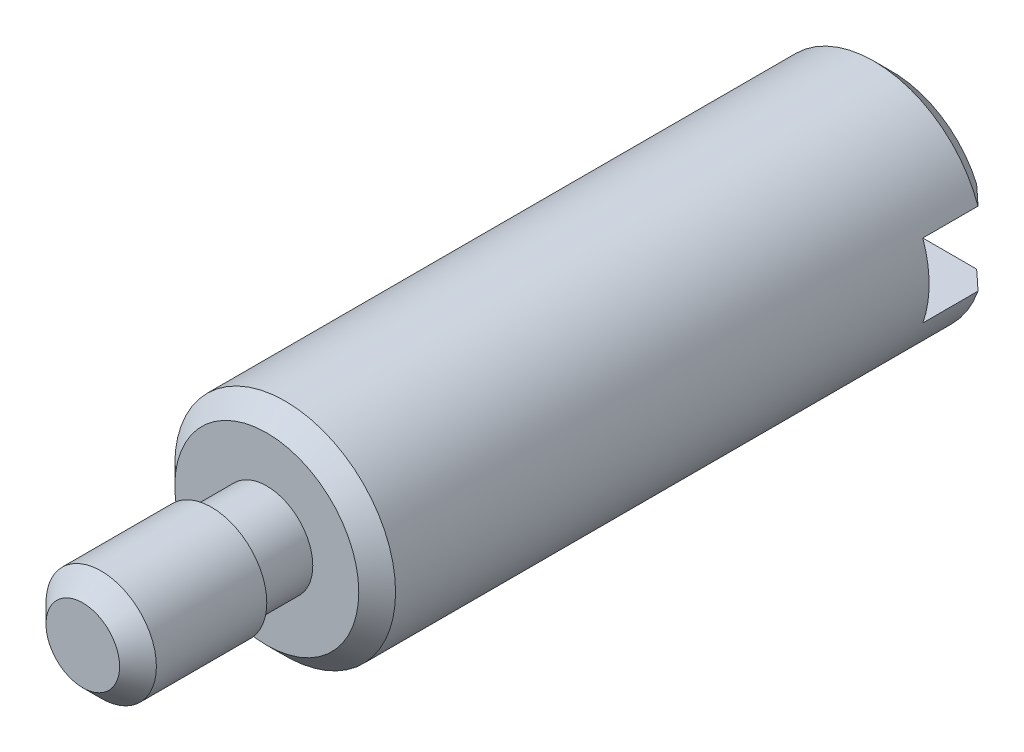
ISO-10303-21;
HEADER;
FILE_DESCRIPTION(('STEP AP214'),'2;1');
FILE_NAME('part.step','',(''),(''),'','','');
FILE_SCHEMA(('AUTOMOTIVE_DESIGN { 1 0 10303 214 1 1 1 1 }'));
ENDSEC;
DATA;
#1=APPLICATION_CONTEXT('core data for automotive mechanical design processes');
#2=APPLICATION_PROTOCOL_DEFINITION('international standard','automotive_design',2000,#1);
#3=PRODUCT_CONTEXT('',#1,'mechanical');
#4=PRODUCT('Part','Part','',(#3));
#5=PRODUCT_RELATED_PRODUCT_CATEGORY('part','',(#4));
#6=PRODUCT_DEFINITION_FORMATION('','',#4);
#7=PRODUCT_DEFINITION_CONTEXT('part definition',#1,'design');
#8=PRODUCT_DEFINITION('design','',#6,#7);
#9=PRODUCT_DEFINITION_SHAPE('','',#8);
#10=(LENGTH_UNIT() NAMED_UNIT(*) SI_UNIT(.MILLI.,.METRE.));
#11=(NAMED_UNIT(*) PLANE_ANGLE_UNIT() SI_UNIT($,.RADIAN.));
#12=(NAMED_UNIT(*) SI_UNIT($,.STERADIAN.) SOLID_ANGLE_UNIT());
#13=UNCERTAINTY_MEASURE_WITH_UNIT(LENGTH_MEASURE(1.E-05),#10,'distance_accuracy_value','');
#14=(GEOMETRIC_REPRESENTATION_CONTEXT(3) GLOBAL_UNCERTAINTY_ASSIGNED_CONTEXT((#13)) GLOBAL_UNIT_ASSIGNED_CONTEXT((#10,
#11,#12)) REPRESENTATION_CONTEXT('',''));
#15=CARTESIAN_POINT('',(0.,0.,0.));
#16=DIRECTION('',(0.,0.,1.));
#17=DIRECTION('',(1.,0.,0.));
#18=AXIS2_PLACEMENT_3D('',#15,#16,#17);
#19=CARTESIAN_POINT('',(0.,0.,0.));
#20=DIRECTION('',(0.,0.,1.));
#21=DIRECTION('',(1.,0.,0.));
#22=AXIS2_PLACEMENT_3D('',#19,#20,#21);
#23=PLANE('',#22);
#24=DIRECTION('',(1.,0.,0.));
#25=VECTOR('',#24,1.);
#26=CARTESIAN_POINT('',(-10.,-1.,0.));
#27=LINE('',#26,#25);
#28=CARTESIAN_POINT('',(-2.29128784747791,-1.,0.));
#29=VERTEX_POINT('',#28);
#30=CARTESIAN_POINT('',(2.29128784747792,-1.,0.));
#31=VERTEX_POINT('',#30);
#32=EDGE_CURVE('E136',#29,#31,#27,.T.);
#33=ORIENTED_EDGE('',*,*,#32,.T.);
#34=CARTESIAN_POINT('',(0.,0.,0.));
#35=DIRECTION('',(0.,0.,1.));
#36=DIRECTION('',(1.,0.,0.));
#37=AXIS2_PLACEMENT_3D('',#34,#35,#36);
#38=CIRCLE('',#37,2.5);
#39=EDGE_CURVE('E145',#31,#29,#38,.F.);
#40=ORIENTED_EDGE('',*,*,#39,.T.);
#41=EDGE_LOOP('',(#33,#40));
#42=FACE_BOUND('',#41,.T.);
#43=ADVANCED_FACE('F36',(#42),#23,.F.);
#44=CARTESIAN_POINT('',(0.,0.,22.));
#45=DIRECTION('',(0.,0.,-1.));
#46=DIRECTION('',(-1.,0.,0.));
#47=AXIS2_PLACEMENT_3D('',#44,#45,#46);
#48=CYLINDRICAL_SURFACE('',#47,1.5);
#49=CARTESIAN_POINT('',(0.,0.,18.5));
#50=DIRECTION('',(0.,0.,1.));
#51=DIRECTION('',(1.,0.,0.));
#52=AXIS2_PLACEMENT_3D('',#49,#50,#51);
#53=CIRCLE('',#52,1.5);
#54=CARTESIAN_POINT('',(1.5,0.,18.5));
#55=VERTEX_POINT('',#54);
#56=EDGE_CURVE('E129',#55,#55,#53,.T.);
#57=ORIENTED_EDGE('',*,*,#56,.T.);
#58=EDGE_LOOP('',(#57));
#59=FACE_BOUND('',#58,.T.);
#60=CARTESIAN_POINT('',(0.,0.,21.5));
#61=DIRECTION('',(0.,0.,1.));
#62=DIRECTION('',(1.,0.,0.));
#63=AXIS2_PLACEMENT_3D('',#60,#61,#62);
#64=CIRCLE('',#63,1.5);
#65=CARTESIAN_POINT('',(1.5,0.,21.5));
#66=VERTEX_POINT('',#65);
#67=EDGE_CURVE('E122',#66,#66,#64,.F.);
#68=ORIENTED_EDGE('',*,*,#67,.T.);
#69=EDGE_LOOP('',(#68));
#70=FACE_BOUND('',#69,.T.);
#71=ADVANCED_FACE('F193',(#59,#70),#48,.T.);
#72=CARTESIAN_POINT('',(0.,0.,22.));
#73=DIRECTION('',(0.,0.,1.));
#74=DIRECTION('',(1.,0.,0.));
#75=AXIS2_PLACEMENT_3D('',#72,#73,#74);
#76=PLANE('',#75);
#77=CARTESIAN_POINT('',(0.,0.,22.));
#78=DIRECTION('',(0.,0.,1.));
#79=DIRECTION('',(1.,0.,0.));
#80=AXIS2_PLACEMENT_3D('',#77,#78,#79);
#81=CIRCLE('',#80,1.);
#82=CARTESIAN_POINT('',(1.,0.,22.));
#83=VERTEX_POINT('',#82);
#84=EDGE_CURVE('E124',#83,#83,#81,.T.);
#85=ORIENTED_EDGE('',*,*,#84,.T.);
#86=EDGE_LOOP('',(#85));
#87=FACE_BOUND('',#86,.T.);
#88=ADVANCED_FACE('F190',(#87),#76,.T.);
#89=CARTESIAN_POINT('',(0.,0.,22.));
#90=DIRECTION('',(0.,0.,-1.));
#91=DIRECTION('',(-1.,0.,0.));
#92=AXIS2_PLACEMENT_3D('',#89,#90,#91);
#93=CONICAL_SURFACE('',#92,1.,0.785398163397447);
#94=ORIENTED_EDGE('',*,*,#67,.F.);
#95=EDGE_LOOP('',(#94));
#96=FACE_BOUND('',#95,.T.);
#97=ORIENTED_EDGE('',*,*,#84,.F.);
#98=EDGE_LOOP('',(#97));
#99=FACE_BOUND('',#98,.T.);
#100=ADVANCED_FACE('F188',(#96,#99),#93,.T.);
#101=CARTESIAN_POINT('',(0.,0.,18.5));
#102=DIRECTION('',(0.,0.,1.));
#103=DIRECTION('',(1.,0.,0.));
#104=AXIS2_PLACEMENT_3D('',#101,#102,#103);
#105=PLANE('',#104);
#106=ORIENTED_EDGE('',*,*,#56,.F.);
#107=EDGE_LOOP('',(#106));
#108=FACE_BOUND('',#107,.T.);
#109=CARTESIAN_POINT('',(0.,0.,18.5));
#110=DIRECTION('',(0.,0.,1.));
#111=DIRECTION('',(1.,0.,0.));
#112=AXIS2_PLACEMENT_3D('',#109,#110,#111);
#113=CIRCLE('',#112,1.25);
#114=CARTESIAN_POINT('',(1.25,0.,18.5));
#115=VERTEX_POINT('',#114);
#116=EDGE_CURVE('E132',#115,#115,#113,.T.);
#117=ORIENTED_EDGE('',*,*,#116,.T.);
#118=EDGE_LOOP('',(#117));
#119=FACE_BOUND('',#118,.T.);
#120=ADVANCED_FACE('F184',(#108,#119),#105,.F.);
#121=CARTESIAN_POINT('',(0.,0.,18.5));
#122=DIRECTION('',(0.,0.,-1.));
#123=DIRECTION('',(-1.,0.,0.));
#124=AXIS2_PLACEMENT_3D('',#121,#122,#123);
#125=CYLINDRICAL_SURFACE('',#124,1.25);
#126=ORIENTED_EDGE('',*,*,#116,.F.);
#127=EDGE_LOOP('',(#126));
#128=FACE_BOUND('',#127,.T.);
#129=CARTESIAN_POINT('',(0.,0.,17.));
#130=DIRECTION('',(0.,0.,1.));
#131=DIRECTION('',(1.,0.,0.));
#132=AXIS2_PLACEMENT_3D('',#129,#130,#131);
#133=CIRCLE('',#132,1.25);
#134=CARTESIAN_POINT('',(1.25,0.,17.));
#135=VERTEX_POINT('',#134);
#136=EDGE_CURVE('E133',#135,#135,#133,.T.);
#137=ORIENTED_EDGE('',*,*,#136,.T.);
#138=EDGE_LOOP('',(#137));
#139=FACE_BOUND('',#138,.T.);
#140=ADVANCED_FACE('F179',(#128,#139),#125,.T.);
#141=DIRECTION('',(1.,0.,0.));
#142=VECTOR('',#141,1.);
#143=CARTESIAN_POINT('',(-10.,1.,0.));
#144=LINE('',#143,#142);
#145=CARTESIAN_POINT('',(-2.29128784747792,1.,0.));
#146=VERTEX_POINT('',#145);
#147=CARTESIAN_POINT('',(2.29128784747792,1.,0.));
#148=VERTEX_POINT('',#147);
#149=EDGE_CURVE('E109',#146,#148,#144,.T.);
#150=ORIENTED_EDGE('',*,*,#149,.F.);
#151=CARTESIAN_POINT('',(0.,0.,0.));
#152=DIRECTION('',(0.,0.,1.));
#153=DIRECTION('',(1.,0.,0.));
#154=AXIS2_PLACEMENT_3D('',#151,#152,#153);
#155=CIRCLE('',#154,2.5);
#156=EDGE_CURVE('E44',#146,#148,#155,.F.);
#157=ORIENTED_EDGE('',*,*,#156,.T.);
#158=EDGE_LOOP('',(#150,#157));
#159=FACE_BOUND('',#158,.T.);
#160=ADVANCED_FACE('F183',(#159),#23,.F.);
#161=CARTESIAN_POINT('',(0.,0.,17.));
#162=DIRECTION('',(0.,0.,-1.));
#163=DIRECTION('',(-1.,0.,0.));
#164=AXIS2_PLACEMENT_3D('',#161,#162,#163);
#165=CYLINDRICAL_SURFACE('',#164,3.);
#166=CARTESIAN_POINT('',(0.,0.,16.5));
#167=DIRECTION('',(0.,0.,1.));
#168=DIRECTION('',(1.,0.,0.));
#169=AXIS2_PLACEMENT_3D('',#166,#167,#168);
#170=CIRCLE('',#169,3.);
#171=CARTESIAN_POINT('',(3.,0.,16.5));
#172=VERTEX_POINT('',#171);
#173=EDGE_CURVE('E117',#172,#172,#170,.F.);
#174=ORIENTED_EDGE('',*,*,#173,.T.);
#175=EDGE_LOOP('',(#174));
#176=FACE_BOUND('',#175,.T.);
#177=DIRECTION('',(0.,0.,-1.));
#178=VECTOR('',#177,1.);
#179=CARTESIAN_POINT('',(-2.82842712474619,-1.,17.));
#180=LINE('',#179,#178);
#181=CARTESIAN_POINT('',(-2.82842712474619,-1.,2.));
#182=VERTEX_POINT('',#181);
#183=CARTESIAN_POINT('',(-2.82842712474619,-1.,0.500000000000004));
#184=VERTEX_POINT('',#183);
#185=EDGE_CURVE('E99',#182,#184,#180,.T.);
#186=ORIENTED_EDGE('',*,*,#185,.T.);
#187=CARTESIAN_POINT('',(0.,0.,0.500000000000004));
#188=DIRECTION('',(0.,0.,1.));
#189=DIRECTION('',(1.,0.,0.));
#190=AXIS2_PLACEMENT_3D('',#187,#188,#189);
#191=CIRCLE('',#190,3.);
#192=CARTESIAN_POINT('',(2.82842712474619,-1.,0.500000000000004));
#193=VERTEX_POINT('',#192);
#194=EDGE_CURVE('E218',#184,#193,#191,.T.);
#195=ORIENTED_EDGE('',*,*,#194,.T.);
#196=DIRECTION('',(0.,0.,-1.));
#197=VECTOR('',#196,1.);
#198=CARTESIAN_POINT('',(2.82842712474619,-1.,17.));
#199=LINE('',#198,#197);
#200=CARTESIAN_POINT('',(2.82842712474619,-1.,2.));
#201=VERTEX_POINT('',#200);
#202=EDGE_CURVE('E115',#193,#201,#199,.F.);
#203=ORIENTED_EDGE('',*,*,#202,.T.);
#204=CARTESIAN_POINT('',(0.,0.,2.));
#205=DIRECTION('',(0.,0.,1.));
#206=DIRECTION('',(0.,-1.,0.));
#207=AXIS2_PLACEMENT_3D('',#204,#205,#206);
#208=CIRCLE('',#207,3.);
#209=CARTESIAN_POINT('',(2.82842712474619,1.,2.));
#210=VERTEX_POINT('',#209);
#211=EDGE_CURVE('E98',#201,#210,#208,.T.);
#212=ORIENTED_EDGE('',*,*,#211,.T.);
#213=DIRECTION('',(0.,0.,-1.));
#214=VECTOR('',#213,1.);
#215=CARTESIAN_POINT('',(2.82842712474619,0.999999999999998,17.));
#216=LINE('',#215,#214);
#217=CARTESIAN_POINT('',(2.82842712474619,0.999999999999998,0.500000000000004));
#218=VERTEX_POINT('',#217);
#219=EDGE_CURVE('E87',#210,#218,#216,.T.);
#220=ORIENTED_EDGE('',*,*,#219,.T.);
#221=CARTESIAN_POINT('',(0.,0.,0.500000000000004));
#222=DIRECTION('',(0.,0.,1.));
#223=DIRECTION('',(1.,0.,0.));
#224=AXIS2_PLACEMENT_3D('',#221,#222,#223);
#225=CIRCLE('',#224,3.);
#226=CARTESIAN_POINT('',(-2.82842712474619,0.999999999999998,0.500000000000004));
#227=VERTEX_POINT('',#226);
#228=EDGE_CURVE('E307',#218,#227,#225,.T.);
#229=ORIENTED_EDGE('',*,*,#228,.T.);
#230=DIRECTION('',(0.,0.,-1.));
#231=VECTOR('',#230,1.);
#232=CARTESIAN_POINT('',(-2.82842712474619,0.999999999999998,17.));
#233=LINE('',#232,#231);
#234=CARTESIAN_POINT('',(-2.82842712474619,0.999999999999998,2.));
#235=VERTEX_POINT('',#234);
#236=EDGE_CURVE('E121',#227,#235,#233,.F.);
#237=ORIENTED_EDGE('',*,*,#236,.T.);
#238=EDGE_CURVE('E107',#235,#182,#208,.T.);
#239=ORIENTED_EDGE('',*,*,#238,.T.);
#240=EDGE_LOOP('',(#186,#195,#203,#212,#220,#229,#237,#239));
#241=FACE_BOUND('',#240,.T.);
#242=ADVANCED_FACE('F112',(#176,#241),#165,.T.);
#243=CARTESIAN_POINT('',(0.,0.,17.));
#244=DIRECTION('',(0.,0.,1.));
#245=DIRECTION('',(1.,0.,0.));
#246=AXIS2_PLACEMENT_3D('',#243,#244,#245);
#247=PLANE('',#246);
#248=CARTESIAN_POINT('',(0.,0.,17.));
#249=DIRECTION('',(0.,0.,1.));
#250=DIRECTION('',(1.,0.,0.));
#251=AXIS2_PLACEMENT_3D('',#248,#249,#250);
#252=CIRCLE('',#251,2.5);
#253=CARTESIAN_POINT('',(2.5,0.,17.));
#254=VERTEX_POINT('',#253);
#255=EDGE_CURVE('E11',#254,#254,#252,.T.);
#256=ORIENTED_EDGE('',*,*,#255,.T.);
#257=EDGE_LOOP('',(#256));
#258=FACE_BOUND('',#257,.T.);
#259=ORIENTED_EDGE('',*,*,#136,.F.);
#260=EDGE_LOOP('',(#259));
#261=FACE_BOUND('',#260,.T.);
#262=ADVANCED_FACE('F198',(#258,#261),#247,.T.);
#263=CARTESIAN_POINT('',(-10.,-1.,0.));
#264=DIRECTION('',(0.,-1.,0.));
#265=DIRECTION('',(0.,0.,-1.));
#266=AXIS2_PLACEMENT_3D('',#263,#264,#265);
#267=PLANE('',#266);
#268=ORIENTED_EDGE('',*,*,#202,.F.);
#269=CARTESIAN_POINT('',(2.82842712474619,-1.,0.500000000000004));
#270=CARTESIAN_POINT('',(2.78393060243607,-1.,0.458049299682899));
#271=CARTESIAN_POINT('',(2.73938013855693,-1.,0.416155705079884));
#272=CARTESIAN_POINT('',(2.65015403367117,-1.,0.332503146617474));
#273=CARTESIAN_POINT('',(2.60547839420257,-1.,0.290744181117352));
#274=CARTESIAN_POINT('',(2.51598341720938,-1.,0.207380143208968));
#275=CARTESIAN_POINT('',(2.47116407923847,-1.,0.165775071279565));
#276=CARTESIAN_POINT('',(2.38135760243373,-1.,0.0827453555177409));
#277=CARTESIAN_POINT('',(2.33637046155038,-1.,0.0413207139025475));
#278=CARTESIAN_POINT('',(2.29128784747792,-1.,0.));
#279=B_SPLINE_CURVE_WITH_KNOTS('',3,(#269,#270,#271,#272,#273,#274,#275,#276,#277,#278),
.UNSPECIFIED.,.F.,.F.,(4,2,2,2,4),(0.,0.183461811793638,0.366921379215904,0.550381517014305,
0.733843902947413),.UNSPECIFIED.);
#280=EDGE_CURVE('E151',#193,#31,#279,.T.);
#281=ORIENTED_EDGE('',*,*,#280,.T.);
#282=ORIENTED_EDGE('',*,*,#32,.F.);
#283=CARTESIAN_POINT('',(-2.29128784747792,-1.,0.));
#284=CARTESIAN_POINT('',(-2.33637046155038,-1.,0.0413207139025476));
#285=CARTESIAN_POINT('',(-2.38135760243373,-1.,0.082745355517741));
#286=CARTESIAN_POINT('',(-2.47116407923847,-1.,0.165775071279565));
#287=CARTESIAN_POINT('',(-2.51598341720938,-1.,0.207380143208969));
#288=CARTESIAN_POINT('',(-2.60547839420257,-1.,0.290744181117352));
#289=CARTESIAN_POINT('',(-2.65015403367117,-1.,0.332503146617475));
#290=CARTESIAN_POINT('',(-2.73938013855693,-1.,0.416155705079884));
#291=CARTESIAN_POINT('',(-2.78393060243607,-1.,0.458049299682899));
#292=CARTESIAN_POINT('',(-2.82842712474619,-1.,0.500000000000003));
#293=B_SPLINE_CURVE_WITH_KNOTS('',3,(#283,#284,#285,#286,#287,#288,#289,#290,#291,#292),
.UNSPECIFIED.,.F.,.F.,(4,2,2,2,4),(0.,0.183462385933107,0.366922523731508,0.550382091153775,
0.733843902947412),.UNSPECIFIED.);
#294=EDGE_CURVE('E152',#29,#184,#293,.T.);
#295=ORIENTED_EDGE('',*,*,#294,.T.);
#296=ORIENTED_EDGE('',*,*,#185,.F.);
#297=DIRECTION('',(1.,0.,0.));
#298=VECTOR('',#297,1.);
#299=CARTESIAN_POINT('',(-10.,-1.,2.));
#300=LINE('',#299,#298);
#301=EDGE_CURVE('E108',#182,#201,#300,.T.);
#302=ORIENTED_EDGE('',*,*,#301,.T.);
#303=EDGE_LOOP('',(#268,#281,#282,#295,#296,#302));
#304=FACE_BOUND('',#303,.T.);
#305=ADVANCED_FACE('F201',(#304),#267,.F.);
#306=CARTESIAN_POINT('',(-10.,1.,2.));
#307=DIRECTION('',(0.,0.,1.));
#308=DIRECTION('',(0.,-1.,0.));
#309=AXIS2_PLACEMENT_3D('',#306,#307,#308);
#310=PLANE('',#309);
#311=ORIENTED_EDGE('',*,*,#301,.F.);
#312=ORIENTED_EDGE('',*,*,#238,.F.);
#313=DIRECTION('',(1.,0.,0.));
#314=VECTOR('',#313,1.);
#315=CARTESIAN_POINT('',(-10.,1.,2.));
#316=LINE('',#315,#314);
#317=EDGE_CURVE('E90',#235,#210,#316,.T.);
#318=ORIENTED_EDGE('',*,*,#317,.T.);
#319=ORIENTED_EDGE('',*,*,#211,.F.);
#320=EDGE_LOOP('',(#311,#312,#318,#319));
#321=FACE_BOUND('',#320,.T.);
#322=ADVANCED_FACE('F104',(#321),#310,.F.);
#323=CARTESIAN_POINT('',(-10.,1.,0.));
#324=DIRECTION('',(0.,1.,0.));
#325=DIRECTION('',(0.,0.,1.));
#326=AXIS2_PLACEMENT_3D('',#323,#324,#325);
#327=PLANE('',#326);
#328=ORIENTED_EDGE('',*,*,#236,.F.);
#329=CARTESIAN_POINT('',(-2.82842712474619,0.999999999999998,0.500000000000004));
#330=CARTESIAN_POINT('',(-2.78393060243607,0.999999999999999,0.4580492996829));
#331=CARTESIAN_POINT('',(-2.73938013855693,1.,0.416155705079884));
#332=CARTESIAN_POINT('',(-2.65015403367117,1.,0.332503146617475));
#333=CARTESIAN_POINT('',(-2.60547839420257,1.,0.290744181117352));
#334=CARTESIAN_POINT('',(-2.51598341720938,1.,0.207380143208969));
#335=CARTESIAN_POINT('',(-2.47116407923847,1.,0.165775071279565));
#336=CARTESIAN_POINT('',(-2.38135760243373,1.,0.0827453555177409));
#337=CARTESIAN_POINT('',(-2.33637046155038,1.,0.0413207139025475));
#338=CARTESIAN_POINT('',(-2.29128784747792,1.,0.));
#339=B_SPLINE_CURVE_WITH_KNOTS('',3,(#329,#330,#331,#332,#333,#334,#335,#336,#337,#338),
.UNSPECIFIED.,.F.,.F.,(4,2,2,2,4),(0.,0.183461811793638,0.366921379215904,0.550381517014306,
0.733843902947413),.UNSPECIFIED.);
#340=EDGE_CURVE('E56',#227,#146,#339,.T.);
#341=ORIENTED_EDGE('',*,*,#340,.T.);
#342=ORIENTED_EDGE('',*,*,#149,.T.);
#343=CARTESIAN_POINT('',(2.29128784747792,1.,0.));
#344=CARTESIAN_POINT('',(2.33637046155038,1.,0.0413207139025478));
#345=CARTESIAN_POINT('',(2.38135760243373,1.,0.0827453555177411));
#346=CARTESIAN_POINT('',(2.47116407923847,1.,0.165775071279565));
#347=CARTESIAN_POINT('',(2.51598341720938,1.,0.207380143208969));
#348=CARTESIAN_POINT('',(2.60547839420257,1.,0.290744181117352));
#349=CARTESIAN_POINT('',(2.65015403367117,1.,0.332503146617475));
#350=CARTESIAN_POINT('',(2.73938013855693,1.,0.416155705079884));
#351=CARTESIAN_POINT('',(2.78393060243607,1.,0.458049299682899));
#352=CARTESIAN_POINT('',(2.82842712474619,1.,0.500000000000004));
#353=B_SPLINE_CURVE_WITH_KNOTS('',3,(#343,#344,#345,#346,#347,#348,#349,#350,#351,#352),
.UNSPECIFIED.,.F.,.F.,(4,2,2,2,4),(0.,0.183462385933107,0.366922523731509,0.550382091153774,
0.733843902947413),.UNSPECIFIED.);
#354=EDGE_CURVE('E93',#148,#218,#353,.T.);
#355=ORIENTED_EDGE('',*,*,#354,.T.);
#356=ORIENTED_EDGE('',*,*,#219,.F.);
#357=ORIENTED_EDGE('',*,*,#317,.F.);
#358=EDGE_LOOP('',(#328,#341,#342,#355,#356,#357));
#359=FACE_BOUND('',#358,.T.);
#360=ADVANCED_FACE('F89',(#359),#327,.F.);
#361=CARTESIAN_POINT('',(0.,0.,0.500000000000004));
#362=DIRECTION('',(0.,0.,1.));
#363=DIRECTION('',(1.,0.,0.));
#364=AXIS2_PLACEMENT_3D('',#361,#362,#363);
#365=CONICAL_SURFACE('',#364,3.,0.78539816339745);
#366=ORIENTED_EDGE('',*,*,#294,.F.);
#367=ORIENTED_EDGE('',*,*,#39,.F.);
#368=ORIENTED_EDGE('',*,*,#280,.F.);
#369=ORIENTED_EDGE('',*,*,#194,.F.);
#370=EDGE_LOOP('',(#366,#367,#368,#369));
#371=FACE_BOUND('',#370,.T.);
#372=ADVANCED_FACE('F149',(#371),#365,.T.);
#373=CARTESIAN_POINT('',(0.,0.,0.500000000000004));
#374=DIRECTION('',(0.,0.,1.));
#375=DIRECTION('',(1.,0.,0.));
#376=AXIS2_PLACEMENT_3D('',#373,#374,#375);
#377=CONICAL_SURFACE('',#376,3.,0.78539816339745);
#378=ORIENTED_EDGE('',*,*,#354,.F.);
#379=ORIENTED_EDGE('',*,*,#156,.F.);
#380=ORIENTED_EDGE('',*,*,#340,.F.);
#381=ORIENTED_EDGE('',*,*,#228,.F.);
#382=EDGE_LOOP('',(#378,#379,#380,#381));
#383=FACE_BOUND('',#382,.T.);
#384=ADVANCED_FACE('F173',(#383),#377,.T.);
#385=CARTESIAN_POINT('',(0.,0.,17.));
#386=DIRECTION('',(0.,0.,-1.));
#387=DIRECTION('',(-1.,0.,0.));
#388=AXIS2_PLACEMENT_3D('',#385,#386,#387);
#389=CONICAL_SURFACE('',#388,2.5,0.785398163397446);
#390=ORIENTED_EDGE('',*,*,#173,.F.);
#391=EDGE_LOOP('',(#390));
#392=FACE_BOUND('',#391,.T.);
#393=ORIENTED_EDGE('',*,*,#255,.F.);
#394=EDGE_LOOP('',(#393));
#395=FACE_BOUND('',#394,.T.);
#396=ADVANCED_FACE('F38',(#392,#395),#389,.T.);
#397=CLOSED_SHELL('',(#43,#71,#88,#100,#120,#140,#160,#242,#262,#305,#322,#360,#372,#384,#396));
#398=MANIFOLD_SOLID_BREP('B2',#397);
#399=ADVANCED_BREP_SHAPE_REPRESENTATION('',(#18,#398),#14);
#400=SHAPE_DEFINITION_REPRESENTATION(#9,#399);
ENDSEC;
END-ISO-10303-21;
